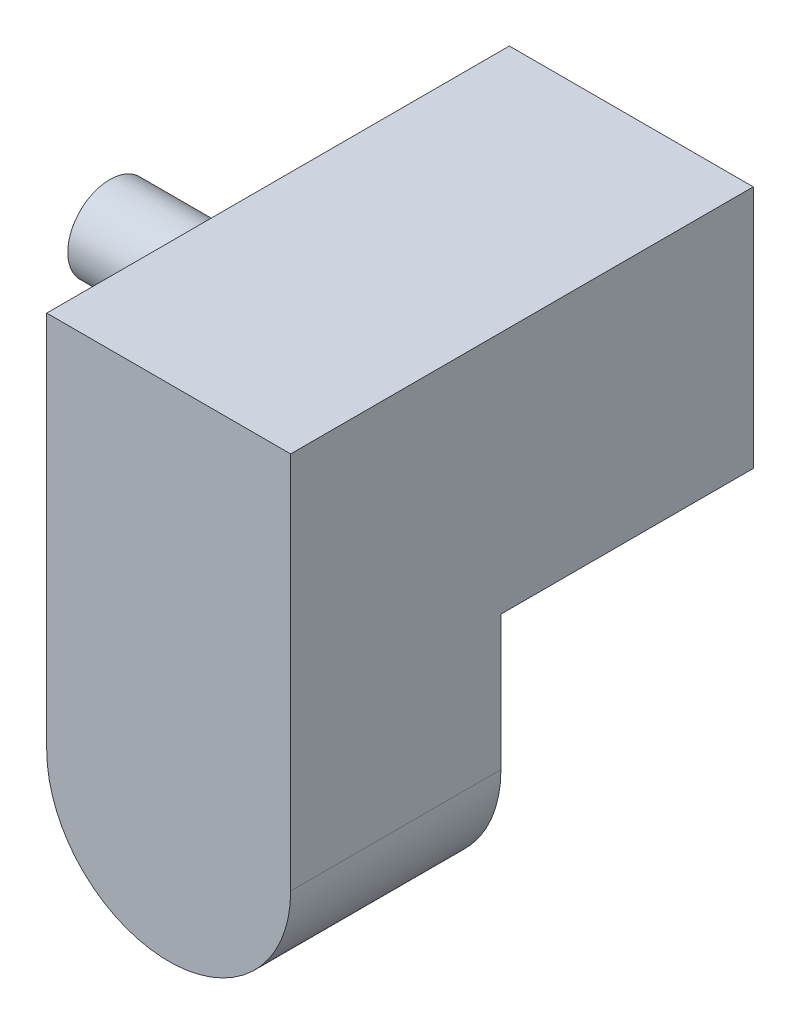
ISO-10303-21;
HEADER;
FILE_DESCRIPTION(('STEP AP214'),'2;1');
FILE_NAME('part.step','',(''),(''),'','','');
FILE_SCHEMA(('AUTOMOTIVE_DESIGN { 1 0 10303 214 1 1 1 1 }'));
ENDSEC;
DATA;
#1=APPLICATION_CONTEXT('core data for automotive mechanical design processes');
#2=APPLICATION_PROTOCOL_DEFINITION('international standard','automotive_design',2000,#1);
#3=PRODUCT_CONTEXT('',#1,'mechanical');
#4=PRODUCT('Part','Part','',(#3));
#5=PRODUCT_RELATED_PRODUCT_CATEGORY('part','',(#4));
#6=PRODUCT_DEFINITION_FORMATION('','',#4);
#7=PRODUCT_DEFINITION_CONTEXT('part definition',#1,'design');
#8=PRODUCT_DEFINITION('design','',#6,#7);
#9=PRODUCT_DEFINITION_SHAPE('','',#8);
#10=(LENGTH_UNIT() NAMED_UNIT(*) SI_UNIT(.MILLI.,.METRE.));
#11=(NAMED_UNIT(*) PLANE_ANGLE_UNIT() SI_UNIT($,.RADIAN.));
#12=(NAMED_UNIT(*) SI_UNIT($,.STERADIAN.) SOLID_ANGLE_UNIT());
#13=UNCERTAINTY_MEASURE_WITH_UNIT(LENGTH_MEASURE(1.E-05),#10,'distance_accuracy_value','');
#14=(GEOMETRIC_REPRESENTATION_CONTEXT(3) GLOBAL_UNCERTAINTY_ASSIGNED_CONTEXT((#13)) GLOBAL_UNIT_ASSIGNED_CONTEXT((#10,
#11,#12)) REPRESENTATION_CONTEXT('',''));
#15=CARTESIAN_POINT('',(0.,0.,0.));
#16=DIRECTION('',(0.,0.,1.));
#17=DIRECTION('',(1.,0.,0.));
#18=AXIS2_PLACEMENT_3D('',#15,#16,#17);
#19=CARTESIAN_POINT('',(0.,0.,63.5));
#20=DIRECTION('',(0.,0.,-1.));
#21=DIRECTION('',(-1.,0.,0.));
#22=AXIS2_PLACEMENT_3D('',#19,#20,#21);
#23=CYLINDRICAL_SURFACE('',#22,36.83);
#24=DIRECTION('',(0.,0.,-1.));
#25=VECTOR('',#24,1.);
#26=CARTESIAN_POINT('',(-36.83,0.,63.5));
#27=LINE('',#26,#25);
#28=CARTESIAN_POINT('',(-36.83,0.,63.5));
#29=VERTEX_POINT('',#28);
#30=CARTESIAN_POINT('',(-36.83,0.,0.));
#31=VERTEX_POINT('',#30);
#32=EDGE_CURVE('E137',#29,#31,#27,.T.);
#33=ORIENTED_EDGE('',*,*,#32,.T.);
#34=CARTESIAN_POINT('',(0.,0.,0.));
#35=DIRECTION('',(0.,0.,1.));
#36=DIRECTION('',(1.,0.,0.));
#37=AXIS2_PLACEMENT_3D('',#34,#35,#36);
#38=CIRCLE('',#37,36.83);
#39=CARTESIAN_POINT('',(36.83,0.,0.));
#40=VERTEX_POINT('',#39);
#41=EDGE_CURVE('E143',#31,#40,#38,.T.);
#42=ORIENTED_EDGE('',*,*,#41,.T.);
#43=DIRECTION('',(0.,0.,-1.));
#44=VECTOR('',#43,1.);
#45=CARTESIAN_POINT('',(36.83,0.,63.5));
#46=LINE('',#45,#44);
#47=CARTESIAN_POINT('',(36.83,0.,63.5));
#48=VERTEX_POINT('',#47);
#49=EDGE_CURVE('E136',#48,#40,#46,.T.);
#50=ORIENTED_EDGE('',*,*,#49,.F.);
#51=CARTESIAN_POINT('',(0.,0.,63.5));
#52=DIRECTION('',(0.,0.,1.));
#53=DIRECTION('',(1.,0.,0.));
#54=AXIS2_PLACEMENT_3D('',#51,#52,#53);
#55=CIRCLE('',#54,36.83);
#56=EDGE_CURVE('E46',#29,#48,#55,.T.);
#57=ORIENTED_EDGE('',*,*,#56,.F.);
#58=EDGE_LOOP('',(#33,#42,#50,#57));
#59=FACE_BOUND('',#58,.T.);
#60=ADVANCED_FACE('F39',(#59),#23,.T.);
#61=CARTESIAN_POINT('',(0.,0.,63.5));
#62=DIRECTION('',(0.,0.,1.));
#63=DIRECTION('',(1.,0.,0.));
#64=AXIS2_PLACEMENT_3D('',#61,#62,#63);
#65=PLANE('',#64);
#66=ORIENTED_EDGE('',*,*,#56,.T.);
#67=DIRECTION('',(0.,1.,0.));
#68=VECTOR('',#67,1.);
#69=CARTESIAN_POINT('',(36.83,0.,63.5));
#70=LINE('',#69,#68);
#71=CARTESIAN_POINT('',(36.83,114.3,63.5));
#72=VERTEX_POINT('',#71);
#73=EDGE_CURVE('E124',#48,#72,#70,.T.);
#74=ORIENTED_EDGE('',*,*,#73,.T.);
#75=DIRECTION('',(-1.,0.,0.));
#76=VECTOR('',#75,1.);
#77=CARTESIAN_POINT('',(-36.83,114.3,63.5));
#78=LINE('',#77,#76);
#79=CARTESIAN_POINT('',(-36.83,114.3,63.5));
#80=VERTEX_POINT('',#79);
#81=EDGE_CURVE('E126',#72,#80,#78,.T.);
#82=ORIENTED_EDGE('',*,*,#81,.T.);
#83=DIRECTION('',(0.,-1.,0.));
#84=VECTOR('',#83,1.);
#85=CARTESIAN_POINT('',(-36.83,0.,63.5));
#86=LINE('',#85,#84);
#87=EDGE_CURVE('E123',#80,#29,#86,.T.);
#88=ORIENTED_EDGE('',*,*,#87,.T.);
#89=EDGE_LOOP('',(#66,#74,#82,#88));
#90=FACE_BOUND('',#89,.T.);
#91=ADVANCED_FACE('F155',(#90),#65,.T.);
#92=CARTESIAN_POINT('',(0.,0.,0.));
#93=DIRECTION('',(0.,0.,1.));
#94=DIRECTION('',(1.,0.,0.));
#95=AXIS2_PLACEMENT_3D('',#92,#93,#94);
#96=PLANE('',#95);
#97=CARTESIAN_POINT('',(0.,0.,0.));
#98=DIRECTION('',(0.,0.,1.));
#99=DIRECTION('',(1.,0.,0.));
#100=AXIS2_PLACEMENT_3D('',#97,#98,#99);
#101=CIRCLE('',#100,13.97);
#102=CARTESIAN_POINT('',(-13.97,0.,0.));
#103=VERTEX_POINT('',#102);
#104=EDGE_CURVE('E206',#103,#103,#101,.T.);
#105=ORIENTED_EDGE('',*,*,#104,.T.);
#106=EDGE_LOOP('',(#105));
#107=FACE_BOUND('',#106,.T.);
#108=DIRECTION('',(0.,-1.,0.));
#109=VECTOR('',#108,1.);
#110=CARTESIAN_POINT('',(-36.83,0.,0.));
#111=LINE('',#110,#109);
#112=CARTESIAN_POINT('',(-36.83,40.64,0.));
#113=VERTEX_POINT('',#112);
#114=EDGE_CURVE('E121',#113,#31,#111,.T.);
#115=ORIENTED_EDGE('',*,*,#114,.F.);
#116=DIRECTION('',(1.,0.,0.));
#117=VECTOR('',#116,1.);
#118=CARTESIAN_POINT('',(-36.83,40.64,0.));
#119=LINE('',#118,#117);
#120=CARTESIAN_POINT('',(36.83,40.64,0.));
#121=VERTEX_POINT('',#120);
#122=EDGE_CURVE('E91',#113,#121,#119,.T.);
#123=ORIENTED_EDGE('',*,*,#122,.T.);
#124=DIRECTION('',(0.,1.,0.));
#125=VECTOR('',#124,1.);
#126=CARTESIAN_POINT('',(36.83,0.,0.));
#127=LINE('',#126,#125);
#128=EDGE_CURVE('E127',#40,#121,#127,.T.);
#129=ORIENTED_EDGE('',*,*,#128,.F.);
#130=ORIENTED_EDGE('',*,*,#41,.F.);
#131=EDGE_LOOP('',(#115,#123,#129,#130));
#132=FACE_BOUND('',#131,.T.);
#133=ADVANCED_FACE('F147',(#107,#132),#96,.F.);
#134=CARTESIAN_POINT('',(-36.83,0.,63.5));
#135=DIRECTION('',(1.,0.,0.));
#136=DIRECTION('',(0.,1.,0.));
#137=AXIS2_PLACEMENT_3D('',#134,#135,#136);
#138=PLANE('',#137);
#139=CARTESIAN_POINT('',(-36.83,76.2,-6.35000000000001));
#140=DIRECTION('',(1.,0.,0.));
#141=DIRECTION('',(0.,1.,0.));
#142=AXIS2_PLACEMENT_3D('',#139,#140,#141);
#143=CIRCLE('',#142,12.7);
#144=CARTESIAN_POINT('',(-36.83,88.9,-6.35000000000001));
#145=VERTEX_POINT('',#144);
#146=EDGE_CURVE('E11',#145,#145,#143,.F.);
#147=ORIENTED_EDGE('',*,*,#146,.F.);
#148=EDGE_LOOP('',(#147));
#149=FACE_BOUND('',#148,.T.);
#150=DIRECTION('',(0.,0.,-1.));
#151=VECTOR('',#150,1.);
#152=CARTESIAN_POINT('',(-36.83,114.3,63.5));
#153=LINE('',#152,#151);
#154=CARTESIAN_POINT('',(-36.83,114.3,-76.2));
#155=VERTEX_POINT('',#154);
#156=EDGE_CURVE('E115',#80,#155,#153,.T.);
#157=ORIENTED_EDGE('',*,*,#156,.T.);
#158=DIRECTION('',(0.,-1.,0.));
#159=VECTOR('',#158,1.);
#160=CARTESIAN_POINT('',(-36.83,114.3,-76.2));
#161=LINE('',#160,#159);
#162=CARTESIAN_POINT('',(-36.83,40.64,-76.2));
#163=VERTEX_POINT('',#162);
#164=EDGE_CURVE('E102',#155,#163,#161,.T.);
#165=ORIENTED_EDGE('',*,*,#164,.T.);
#166=DIRECTION('',(0.,0.,1.));
#167=VECTOR('',#166,1.);
#168=CARTESIAN_POINT('',(-36.83,40.64,-76.2));
#169=LINE('',#168,#167);
#170=EDGE_CURVE('E90',#163,#113,#169,.T.);
#171=ORIENTED_EDGE('',*,*,#170,.T.);
#172=ORIENTED_EDGE('',*,*,#114,.T.);
#173=ORIENTED_EDGE('',*,*,#32,.F.);
#174=ORIENTED_EDGE('',*,*,#87,.F.);
#175=EDGE_LOOP('',(#157,#165,#171,#172,#173,#174));
#176=FACE_BOUND('',#175,.T.);
#177=ADVANCED_FACE('F108',(#149,#176),#138,.F.);
#178=CARTESIAN_POINT('',(36.83,0.,63.5));
#179=DIRECTION('',(-1.,0.,0.));
#180=DIRECTION('',(0.,-1.,0.));
#181=AXIS2_PLACEMENT_3D('',#178,#179,#180);
#182=PLANE('',#181);
#183=ORIENTED_EDGE('',*,*,#128,.T.);
#184=DIRECTION('',(0.,0.,1.));
#185=VECTOR('',#184,1.);
#186=CARTESIAN_POINT('',(36.83,40.64,-76.2));
#187=LINE('',#186,#185);
#188=CARTESIAN_POINT('',(36.83,40.64,-76.2));
#189=VERTEX_POINT('',#188);
#190=EDGE_CURVE('E52',#189,#121,#187,.T.);
#191=ORIENTED_EDGE('',*,*,#190,.F.);
#192=DIRECTION('',(0.,1.,0.));
#193=VECTOR('',#192,1.);
#194=CARTESIAN_POINT('',(36.83,114.3,-76.2));
#195=LINE('',#194,#193);
#196=CARTESIAN_POINT('',(36.83,114.3,-76.2));
#197=VERTEX_POINT('',#196);
#198=EDGE_CURVE('E110',#189,#197,#195,.T.);
#199=ORIENTED_EDGE('',*,*,#198,.T.);
#200=DIRECTION('',(0.,0.,-1.));
#201=VECTOR('',#200,1.);
#202=CARTESIAN_POINT('',(36.83,114.3,63.5));
#203=LINE('',#202,#201);
#204=EDGE_CURVE('E133',#72,#197,#203,.T.);
#205=ORIENTED_EDGE('',*,*,#204,.F.);
#206=ORIENTED_EDGE('',*,*,#73,.F.);
#207=ORIENTED_EDGE('',*,*,#49,.T.);
#208=EDGE_LOOP('',(#183,#191,#199,#205,#206,#207));
#209=FACE_BOUND('',#208,.T.);
#210=ADVANCED_FACE('F146',(#209),#182,.F.);
#211=CARTESIAN_POINT('',(-36.83,114.3,63.5));
#212=DIRECTION('',(0.,-1.,0.));
#213=DIRECTION('',(0.,0.,-1.));
#214=AXIS2_PLACEMENT_3D('',#211,#212,#213);
#215=PLANE('',#214);
#216=ORIENTED_EDGE('',*,*,#204,.T.);
#217=DIRECTION('',(-1.,0.,0.));
#218=VECTOR('',#217,1.);
#219=CARTESIAN_POINT('',(-36.83,114.3,-76.2));
#220=LINE('',#219,#218);
#221=EDGE_CURVE('E100',#197,#155,#220,.T.);
#222=ORIENTED_EDGE('',*,*,#221,.T.);
#223=ORIENTED_EDGE('',*,*,#156,.F.);
#224=ORIENTED_EDGE('',*,*,#81,.F.);
#225=EDGE_LOOP('',(#216,#222,#223,#224));
#226=FACE_BOUND('',#225,.T.);
#227=ADVANCED_FACE('F154',(#226),#215,.F.);
#228=CARTESIAN_POINT('',(-36.83,40.64,-76.2));
#229=DIRECTION('',(0.,-1.,0.));
#230=DIRECTION('',(0.,0.,-1.));
#231=AXIS2_PLACEMENT_3D('',#228,#229,#230);
#232=PLANE('',#231);
#233=ORIENTED_EDGE('',*,*,#122,.F.);
#234=ORIENTED_EDGE('',*,*,#170,.F.);
#235=DIRECTION('',(1.,0.,0.));
#236=VECTOR('',#235,1.);
#237=CARTESIAN_POINT('',(-36.83,40.64,-76.2));
#238=LINE('',#237,#236);
#239=EDGE_CURVE('E95',#163,#189,#238,.T.);
#240=ORIENTED_EDGE('',*,*,#239,.T.);
#241=ORIENTED_EDGE('',*,*,#190,.T.);
#242=EDGE_LOOP('',(#233,#234,#240,#241));
#243=FACE_BOUND('',#242,.T.);
#244=ADVANCED_FACE('F93',(#243),#232,.T.);
#245=CARTESIAN_POINT('',(0.,0.,-76.2));
#246=DIRECTION('',(0.,0.,1.));
#247=DIRECTION('',(1.,0.,0.));
#248=AXIS2_PLACEMENT_3D('',#245,#246,#247);
#249=PLANE('',#248);
#250=ORIENTED_EDGE('',*,*,#164,.F.);
#251=ORIENTED_EDGE('',*,*,#221,.F.);
#252=ORIENTED_EDGE('',*,*,#198,.F.);
#253=ORIENTED_EDGE('',*,*,#239,.F.);
#254=EDGE_LOOP('',(#250,#251,#252,#253));
#255=FACE_BOUND('',#254,.T.);
#256=ADVANCED_FACE('F105',(#255),#249,.F.);
#257=CARTESIAN_POINT('',(-87.63,76.2,-6.35000000000001));
#258=DIRECTION('',(1.,0.,0.));
#259=DIRECTION('',(0.,1.,0.));
#260=AXIS2_PLACEMENT_3D('',#257,#258,#259);
#261=CYLINDRICAL_SURFACE('',#260,12.7);
#262=CARTESIAN_POINT('',(-87.63,76.2,-6.35000000000001));
#263=DIRECTION('',(-1.,0.,0.));
#264=DIRECTION('',(0.,-1.,0.));
#265=AXIS2_PLACEMENT_3D('',#262,#263,#264);
#266=CIRCLE('',#265,12.7);
#267=CARTESIAN_POINT('',(-87.63,63.5,-6.35000000000001));
#268=VERTEX_POINT('',#267);
#269=EDGE_CURVE('E111',#268,#268,#266,.T.);
#270=ORIENTED_EDGE('',*,*,#269,.F.);
#271=EDGE_LOOP('',(#270));
#272=FACE_BOUND('',#271,.T.);
#273=ORIENTED_EDGE('',*,*,#146,.T.);
#274=EDGE_LOOP('',(#273));
#275=FACE_BOUND('',#274,.T.);
#276=ADVANCED_FACE('F185',(#272,#275),#261,.T.);
#277=CARTESIAN_POINT('',(-87.63,76.2,-6.35000000000001));
#278=DIRECTION('',(-1.,0.,0.));
#279=DIRECTION('',(0.,-1.,0.));
#280=AXIS2_PLACEMENT_3D('',#277,#278,#279);
#281=PLANE('',#280);
#282=ORIENTED_EDGE('',*,*,#269,.T.);
#283=EDGE_LOOP('',(#282));
#284=FACE_BOUND('',#283,.T.);
#285=ADVANCED_FACE('F181',(#284),#281,.T.);
#286=CARTESIAN_POINT('',(0.,0.,48.26));
#287=DIRECTION('',(0.,0.,-1.));
#288=DIRECTION('',(-1.,0.,0.));
#289=AXIS2_PLACEMENT_3D('',#286,#287,#288);
#290=CYLINDRICAL_SURFACE('',#289,13.97);
#291=CARTESIAN_POINT('',(0.,0.,48.26));
#292=DIRECTION('',(0.,0.,1.));
#293=DIRECTION('',(1.,0.,0.));
#294=AXIS2_PLACEMENT_3D('',#291,#292,#293);
#295=CIRCLE('',#294,13.97);
#296=CARTESIAN_POINT('',(-13.97,0.,48.26));
#297=VERTEX_POINT('',#296);
#298=EDGE_CURVE('E202',#297,#297,#295,.T.);
#299=CARTESIAN_POINT('',(-13.97,0.,48.26));
#300=CARTESIAN_POINT('',(-13.97,0.,47.7572916666667));
#301=CARTESIAN_POINT('',(-13.97,0.,47.2545833333333));
#302=CARTESIAN_POINT('',(-13.97,0.,46.2491666666667));
#303=CARTESIAN_POINT('',(-13.97,0.,45.7464583333333));
#304=CARTESIAN_POINT('',(-13.97,0.,44.7410416666667));
#305=CARTESIAN_POINT('',(-13.97,0.,44.2383333333333));
#306=CARTESIAN_POINT('',(-13.97,0.,43.2329166666667));
#307=CARTESIAN_POINT('',(-13.97,0.,42.7302083333333));
#308=CARTESIAN_POINT('',(-13.97,0.,41.7247916666667));
#309=CARTESIAN_POINT('',(-13.97,0.,41.2220833333333));
#310=CARTESIAN_POINT('',(-13.97,0.,40.2166666666667));
#311=CARTESIAN_POINT('',(-13.97,0.,39.7139583333333));
#312=CARTESIAN_POINT('',(-13.97,0.,38.7085416666667));
#313=CARTESIAN_POINT('',(-13.97,0.,38.2058333333333));
#314=CARTESIAN_POINT('',(-13.97,0.,37.2004166666667));
#315=CARTESIAN_POINT('',(-13.97,0.,36.6977083333333));
#316=CARTESIAN_POINT('',(-13.97,0.,35.6922916666667));
#317=CARTESIAN_POINT('',(-13.97,0.,35.1895833333333));
#318=CARTESIAN_POINT('',(-13.97,0.,34.1841666666667));
#319=CARTESIAN_POINT('',(-13.97,0.,33.6814583333333));
#320=CARTESIAN_POINT('',(-13.97,0.,32.6760416666667));
#321=CARTESIAN_POINT('',(-13.97,0.,32.1733333333333));
#322=CARTESIAN_POINT('',(-13.97,0.,31.1679166666667));
#323=CARTESIAN_POINT('',(-13.97,0.,30.6652083333333));
#324=CARTESIAN_POINT('',(-13.97,0.,29.6597916666667));
#325=CARTESIAN_POINT('',(-13.97,0.,29.1570833333333));
#326=CARTESIAN_POINT('',(-13.97,0.,28.1516666666667));
#327=CARTESIAN_POINT('',(-13.97,0.,27.6489583333333));
#328=CARTESIAN_POINT('',(-13.97,0.,26.6435416666667));
#329=CARTESIAN_POINT('',(-13.97,0.,26.1408333333333));
#330=CARTESIAN_POINT('',(-13.97,0.,25.1354166666667));
#331=CARTESIAN_POINT('',(-13.97,0.,24.6327083333333));
#332=CARTESIAN_POINT('',(-13.97,0.,23.6272916666667));
#333=CARTESIAN_POINT('',(-13.97,0.,23.1245833333333));
#334=CARTESIAN_POINT('',(-13.97,0.,22.1191666666667));
#335=CARTESIAN_POINT('',(-13.97,0.,21.6164583333333));
#336=CARTESIAN_POINT('',(-13.97,0.,20.6110416666667));
#337=CARTESIAN_POINT('',(-13.97,0.,20.1083333333333));
#338=CARTESIAN_POINT('',(-13.97,0.,19.1029166666667));
#339=CARTESIAN_POINT('',(-13.97,0.,18.6002083333333));
#340=CARTESIAN_POINT('',(-13.97,0.,17.5947916666667));
#341=CARTESIAN_POINT('',(-13.97,0.,17.0920833333333));
#342=CARTESIAN_POINT('',(-13.97,0.,16.0866666666667));
#343=CARTESIAN_POINT('',(-13.97,0.,15.5839583333333));
#344=CARTESIAN_POINT('',(-13.97,0.,14.5785416666667));
#345=CARTESIAN_POINT('',(-13.97,0.,14.0758333333333));
#346=CARTESIAN_POINT('',(-13.97,0.,13.0704166666667));
#347=CARTESIAN_POINT('',(-13.97,0.,12.5677083333333));
#348=CARTESIAN_POINT('',(-13.97,0.,11.5622916666667));
#349=CARTESIAN_POINT('',(-13.97,0.,11.0595833333333));
#350=CARTESIAN_POINT('',(-13.97,0.,10.0541666666667));
#351=CARTESIAN_POINT('',(-13.97,0.,9.55145833333333));
#352=CARTESIAN_POINT('',(-13.97,0.,8.54604166666666));
#353=CARTESIAN_POINT('',(-13.97,0.,8.04333333333333));
#354=CARTESIAN_POINT('',(-13.97,0.,7.03791666666666));
#355=CARTESIAN_POINT('',(-13.97,0.,6.53520833333333));
#356=CARTESIAN_POINT('',(-13.97,0.,5.52979166666666));
#357=CARTESIAN_POINT('',(-13.97,0.,5.02708333333333));
#358=CARTESIAN_POINT('',(-13.97,0.,4.02166666666666));
#359=CARTESIAN_POINT('',(-13.97,0.,3.51895833333332));
#360=CARTESIAN_POINT('',(-13.97,0.,2.51354166666666));
#361=CARTESIAN_POINT('',(-13.97,0.,2.01083333333333));
#362=CARTESIAN_POINT('',(-13.97,0.,1.00541666666666));
#363=CARTESIAN_POINT('',(-13.97,0.,0.502708333333326));
#364=CARTESIAN_POINT('',(-13.97,0.,0.));
#365=B_SPLINE_CURVE_WITH_KNOTS('',3,(#299,#300,#301,#302,#303,#304,#305,#306,#307,#308,#309,
#310,#311,#312,#313,#314,#315,#316,#317,#318,#319,#320,#321,#322,#323,#324,#325,#326,#327,#328,
#329,#330,#331,#332,#333,#334,#335,#336,#337,#338,#339,#340,#341,#342,#343,#344,#345,#346,#347,
#348,#349,#350,#351,#352,#353,#354,#355,#356,#357,#358,#359,#360,#361,#362,#363,#364),
.UNSPECIFIED.,.F.,.F.,(4,2,2,2,2,2,2,2,2,2,2,2,2,2,2,2,2,2,2,2,2,2,2,2,2,2,2,2,2,2,2,2,4),(0.,
1.508125,3.01625,4.524375,6.0325,7.540625,9.04874999999999,10.556875,12.065,13.573125,15.08125,
16.589375,18.0975,19.605625,21.11375,22.621875,24.13,25.638125,27.14625,28.654375,30.1625,
31.670625,33.17875,34.686875,36.195,37.703125,39.21125,40.719375,42.2275,43.735625,45.24375,
46.751875,48.26),.UNSPECIFIED.);
#366=EDGE_CURVE('BSEAM188',#297,#103,#365,.T.);
#367=ORIENTED_EDGE('',*,*,#298,.T.);
#368=ORIENTED_EDGE('',*,*,#104,.F.);
#369=ORIENTED_EDGE('',*,*,#366,.T.);
#370=ORIENTED_EDGE('',*,*,#366,.F.);
#371=EDGE_LOOP('',(#367,#369,#368,#370));
#372=FACE_BOUND('',#371,.T.);
#373=ADVANCED_FACE('F188',(#372),#290,.F.);
#374=CARTESIAN_POINT('',(0.,0.,48.26));
#375=DIRECTION('',(0.,0.,1.));
#376=DIRECTION('',(1.,0.,0.));
#377=AXIS2_PLACEMENT_3D('',#374,#375,#376);
#378=PLANE('',#377);
#379=ORIENTED_EDGE('',*,*,#298,.F.);
#380=EDGE_LOOP('',(#379));
#381=FACE_BOUND('',#380,.T.);
#382=ADVANCED_FACE('F197',(#381),#378,.F.);
#383=CLOSED_SHELL('',(#60,#91,#133,#177,#210,#227,#244,#256,#276,#285,#373,#382));
#384=MANIFOLD_SOLID_BREP('B2',#383);
#385=ADVANCED_BREP_SHAPE_REPRESENTATION('',(#18,#384),#14);
#386=SHAPE_DEFINITION_REPRESENTATION(#9,#385);
ENDSEC;
END-ISO-10303-21;
